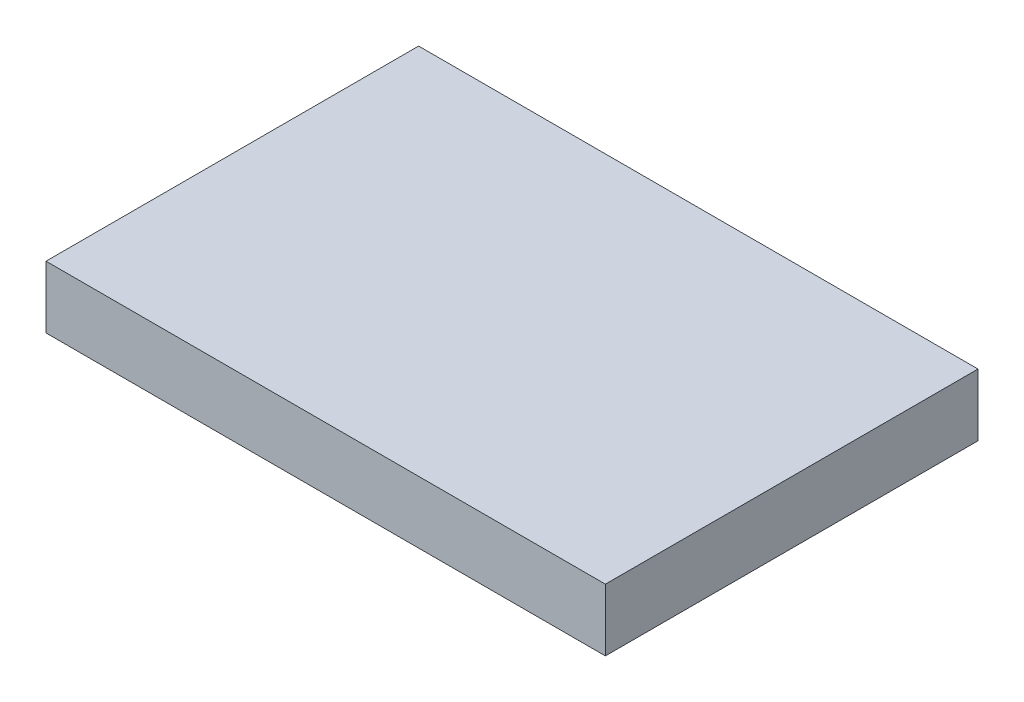
ISO-10303-21;
HEADER;
FILE_DESCRIPTION(('STEP AP214'),'2;1');
FILE_NAME('part.step','',(''),(''),'','','');
FILE_SCHEMA(('AUTOMOTIVE_DESIGN { 1 0 10303 214 1 1 1 1 }'));
ENDSEC;
DATA;
#1=APPLICATION_CONTEXT('core data for automotive mechanical design processes');
#2=APPLICATION_PROTOCOL_DEFINITION('international standard','automotive_design',2000,#1);
#3=PRODUCT_CONTEXT('',#1,'mechanical');
#4=PRODUCT('Part','Part','',(#3));
#5=PRODUCT_RELATED_PRODUCT_CATEGORY('part','',(#4));
#6=PRODUCT_DEFINITION_FORMATION('','',#4);
#7=PRODUCT_DEFINITION_CONTEXT('part definition',#1,'design');
#8=PRODUCT_DEFINITION('design','',#6,#7);
#9=PRODUCT_DEFINITION_SHAPE('','',#8);
#10=(LENGTH_UNIT() NAMED_UNIT(*) SI_UNIT(.MILLI.,.METRE.));
#11=(NAMED_UNIT(*) PLANE_ANGLE_UNIT() SI_UNIT($,.RADIAN.));
#12=(NAMED_UNIT(*) SI_UNIT($,.STERADIAN.) SOLID_ANGLE_UNIT());
#13=UNCERTAINTY_MEASURE_WITH_UNIT(LENGTH_MEASURE(1.E-05),#10,'distance_accuracy_value','');
#14=(GEOMETRIC_REPRESENTATION_CONTEXT(3) GLOBAL_UNCERTAINTY_ASSIGNED_CONTEXT((#13)) GLOBAL_UNIT_ASSIGNED_CONTEXT((#10,
#11,#12)) REPRESENTATION_CONTEXT('',''));
#15=CARTESIAN_POINT('',(0.,0.,0.));
#16=DIRECTION('',(0.,0.,1.));
#17=DIRECTION('',(1.,0.,0.));
#18=AXIS2_PLACEMENT_3D('',#15,#16,#17);
#19=CARTESIAN_POINT('',(0.,-12.7,-76.109285411475));
#20=DIRECTION('',(0.,0.,-1.));
#21=DIRECTION('',(-1.,0.,0.));
#22=AXIS2_PLACEMENT_3D('',#19,#20,#21);
#23=PLANE('',#22);
#24=DIRECTION('',(-1.,0.,0.));
#25=VECTOR('',#24,1.);
#26=CARTESIAN_POINT('',(0.,0.,-76.109285411475));
#27=LINE('',#26,#25);
#28=CARTESIAN_POINT('',(0.,0.,-76.109285411475));
#29=VERTEX_POINT('',#28);
#30=CARTESIAN_POINT('',(-114.261019043062,0.,-76.109285411475));
#31=VERTEX_POINT('',#30);
#32=EDGE_CURVE('E97',#29,#31,#27,.T.);
#33=ORIENTED_EDGE('',*,*,#32,.F.);
#34=DIRECTION('',(0.,1.,0.));
#35=VECTOR('',#34,1.);
#36=CARTESIAN_POINT('',(0.,-12.7,-76.109285411475));
#37=LINE('',#36,#35);
#38=CARTESIAN_POINT('',(0.,-12.7,-76.109285411475));
#39=VERTEX_POINT('',#38);
#40=EDGE_CURVE('E11',#39,#29,#37,.T.);
#41=ORIENTED_EDGE('',*,*,#40,.F.);
#42=DIRECTION('',(-1.,0.,0.));
#43=VECTOR('',#42,1.);
#44=CARTESIAN_POINT('',(0.,-12.7,-76.109285411475));
#45=LINE('',#44,#43);
#46=CARTESIAN_POINT('',(-114.261019043062,-12.7,-76.109285411475));
#47=VERTEX_POINT('',#46);
#48=EDGE_CURVE('E91',#39,#47,#45,.T.);
#49=ORIENTED_EDGE('',*,*,#48,.T.);
#50=DIRECTION('',(0.,1.,0.));
#51=VECTOR('',#50,1.);
#52=CARTESIAN_POINT('',(-114.261019043062,-12.7,-76.109285411475));
#53=LINE('',#52,#51);
#54=EDGE_CURVE('E36',#47,#31,#53,.T.);
#55=ORIENTED_EDGE('',*,*,#54,.T.);
#56=EDGE_LOOP('',(#33,#41,#49,#55));
#57=FACE_BOUND('',#56,.T.);
#58=ADVANCED_FACE('F33',(#57),#23,.T.);
#59=CARTESIAN_POINT('',(0.,-12.7,0.));
#60=DIRECTION('',(1.,0.,0.));
#61=DIRECTION('',(0.,0.,-1.));
#62=AXIS2_PLACEMENT_3D('',#59,#60,#61);
#63=PLANE('',#62);
#64=DIRECTION('',(0.,0.,-1.));
#65=VECTOR('',#64,1.);
#66=CARTESIAN_POINT('',(0.,0.,0.));
#67=LINE('',#66,#65);
#68=CARTESIAN_POINT('',(0.,0.,0.));
#69=VERTEX_POINT('',#68);
#70=EDGE_CURVE('E93',#69,#29,#67,.T.);
#71=ORIENTED_EDGE('',*,*,#70,.F.);
#72=DIRECTION('',(0.,1.,0.));
#73=VECTOR('',#72,1.);
#74=CARTESIAN_POINT('',(0.,-12.7,0.));
#75=LINE('',#74,#73);
#76=CARTESIAN_POINT('',(0.,-12.7,0.));
#77=VERTEX_POINT('',#76);
#78=EDGE_CURVE('E42',#77,#69,#75,.T.);
#79=ORIENTED_EDGE('',*,*,#78,.F.);
#80=DIRECTION('',(0.,0.,-1.));
#81=VECTOR('',#80,1.);
#82=CARTESIAN_POINT('',(0.,-12.7,0.));
#83=LINE('',#82,#81);
#84=EDGE_CURVE('E81',#77,#39,#83,.T.);
#85=ORIENTED_EDGE('',*,*,#84,.T.);
#86=ORIENTED_EDGE('',*,*,#40,.T.);
#87=EDGE_LOOP('',(#71,#79,#85,#86));
#88=FACE_BOUND('',#87,.T.);
#89=ADVANCED_FACE('F107',(#88),#63,.T.);
#90=CARTESIAN_POINT('',(0.,-12.7,0.));
#91=DIRECTION('',(0.,0.,-1.));
#92=DIRECTION('',(-1.,0.,0.));
#93=AXIS2_PLACEMENT_3D('',#90,#91,#92);
#94=PLANE('',#93);
#95=DIRECTION('',(-1.,0.,0.));
#96=VECTOR('',#95,1.);
#97=CARTESIAN_POINT('',(0.,0.,0.));
#98=LINE('',#97,#96);
#99=CARTESIAN_POINT('',(-114.261019043062,0.,0.));
#100=VERTEX_POINT('',#99);
#101=EDGE_CURVE('E86',#69,#100,#98,.T.);
#102=ORIENTED_EDGE('',*,*,#101,.T.);
#103=DIRECTION('',(0.,1.,0.));
#104=VECTOR('',#103,1.);
#105=CARTESIAN_POINT('',(-114.261019043062,-12.7,0.));
#106=LINE('',#105,#104);
#107=CARTESIAN_POINT('',(-114.261019043062,-12.7,0.));
#108=VERTEX_POINT('',#107);
#109=EDGE_CURVE('E84',#108,#100,#106,.T.);
#110=ORIENTED_EDGE('',*,*,#109,.F.);
#111=DIRECTION('',(-1.,0.,0.));
#112=VECTOR('',#111,1.);
#113=CARTESIAN_POINT('',(0.,-12.7,0.));
#114=LINE('',#113,#112);
#115=EDGE_CURVE('E78',#77,#108,#114,.T.);
#116=ORIENTED_EDGE('',*,*,#115,.F.);
#117=ORIENTED_EDGE('',*,*,#78,.T.);
#118=EDGE_LOOP('',(#102,#110,#116,#117));
#119=FACE_BOUND('',#118,.T.);
#120=ADVANCED_FACE('F85',(#119),#94,.F.);
#121=CARTESIAN_POINT('',(-114.261019043062,-12.7,0.));
#122=DIRECTION('',(1.,0.,0.));
#123=DIRECTION('',(0.,0.,-1.));
#124=AXIS2_PLACEMENT_3D('',#121,#122,#123);
#125=PLANE('',#124);
#126=DIRECTION('',(0.,0.,-1.));
#127=VECTOR('',#126,1.);
#128=CARTESIAN_POINT('',(-114.261019043062,0.,0.));
#129=LINE('',#128,#127);
#130=EDGE_CURVE('E100',#100,#31,#129,.T.);
#131=ORIENTED_EDGE('',*,*,#130,.T.);
#132=ORIENTED_EDGE('',*,*,#54,.F.);
#133=DIRECTION('',(0.,0.,-1.));
#134=VECTOR('',#133,1.);
#135=CARTESIAN_POINT('',(-114.261019043062,-12.7,0.));
#136=LINE('',#135,#134);
#137=EDGE_CURVE('E75',#108,#47,#136,.T.);
#138=ORIENTED_EDGE('',*,*,#137,.F.);
#139=ORIENTED_EDGE('',*,*,#109,.T.);
#140=EDGE_LOOP('',(#131,#132,#138,#139));
#141=FACE_BOUND('',#140,.T.);
#142=ADVANCED_FACE('F90',(#141),#125,.F.);
#143=CARTESIAN_POINT('',(0.,-12.7,0.));
#144=DIRECTION('',(0.,-1.,0.));
#145=DIRECTION('',(0.,0.,-1.));
#146=AXIS2_PLACEMENT_3D('',#143,#144,#145);
#147=PLANE('',#146);
#148=ORIENTED_EDGE('',*,*,#48,.F.);
#149=ORIENTED_EDGE('',*,*,#84,.F.);
#150=ORIENTED_EDGE('',*,*,#115,.T.);
#151=ORIENTED_EDGE('',*,*,#137,.T.);
#152=EDGE_LOOP('',(#148,#149,#150,#151));
#153=FACE_BOUND('',#152,.T.);
#154=ADVANCED_FACE('F80',(#153),#147,.T.);
#155=CARTESIAN_POINT('',(0.,0.,0.));
#156=DIRECTION('',(0.,-1.,0.));
#157=DIRECTION('',(0.,0.,-1.));
#158=AXIS2_PLACEMENT_3D('',#155,#156,#157);
#159=PLANE('',#158);
#160=ORIENTED_EDGE('',*,*,#32,.T.);
#161=ORIENTED_EDGE('',*,*,#130,.F.);
#162=ORIENTED_EDGE('',*,*,#101,.F.);
#163=ORIENTED_EDGE('',*,*,#70,.T.);
#164=EDGE_LOOP('',(#160,#161,#162,#163));
#165=FACE_BOUND('',#164,.T.);
#166=ADVANCED_FACE('F106',(#165),#159,.F.);
#167=CLOSED_SHELL('',(#58,#89,#120,#142,#154,#166));
#168=MANIFOLD_SOLID_BREP('B2',#167);
#169=ADVANCED_BREP_SHAPE_REPRESENTATION('',(#18,#168),#14);
#170=SHAPE_DEFINITION_REPRESENTATION(#9,#169);
ENDSEC;
END-ISO-10303-21;
